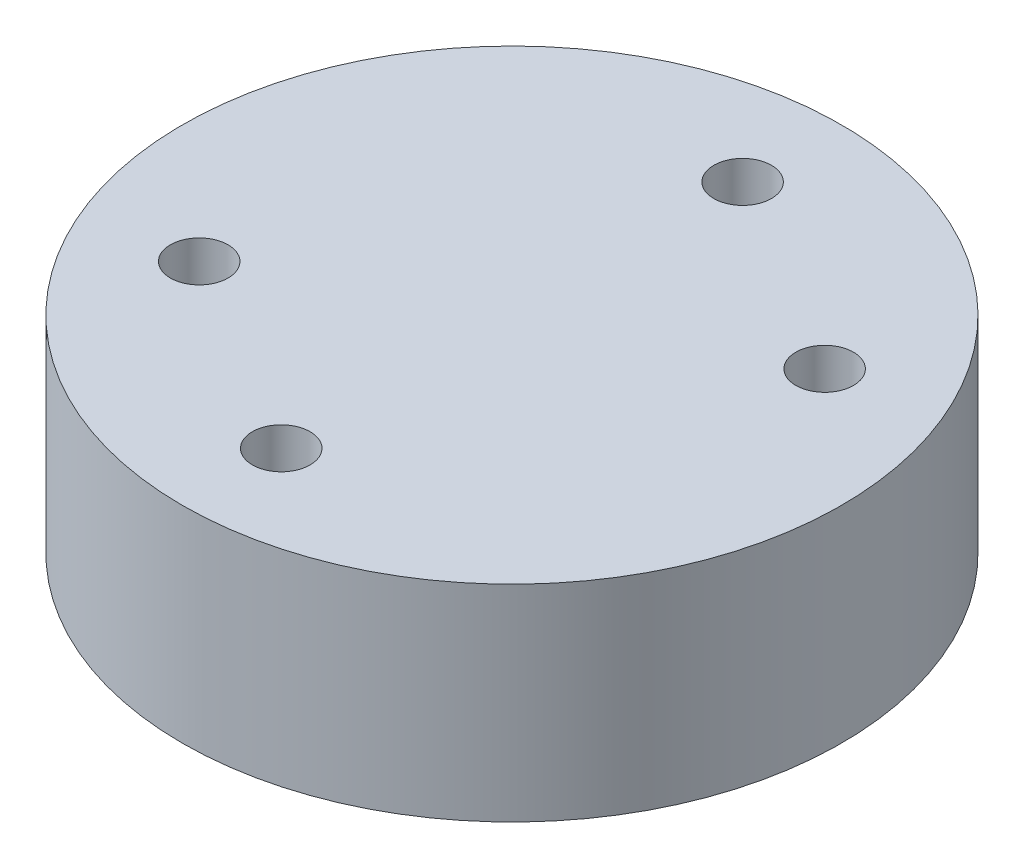
ISO-10303-21;
HEADER;
FILE_DESCRIPTION(('STEP AP214'),'2;1');
FILE_NAME('part.step','',(''),(''),'','','');
FILE_SCHEMA(('AUTOMOTIVE_DESIGN { 1 0 10303 214 1 1 1 1 }'));
ENDSEC;
DATA;
#1=APPLICATION_CONTEXT('core data for automotive mechanical design processes');
#2=APPLICATION_PROTOCOL_DEFINITION('international standard','automotive_design',2000,#1);
#3=PRODUCT_CONTEXT('',#1,'mechanical');
#4=PRODUCT('Part','Part','',(#3));
#5=PRODUCT_RELATED_PRODUCT_CATEGORY('part','',(#4));
#6=PRODUCT_DEFINITION_FORMATION('','',#4);
#7=PRODUCT_DEFINITION_CONTEXT('part definition',#1,'design');
#8=PRODUCT_DEFINITION('design','',#6,#7);
#9=PRODUCT_DEFINITION_SHAPE('','',#8);
#10=(LENGTH_UNIT() NAMED_UNIT(*) SI_UNIT(.MILLI.,.METRE.));
#11=(NAMED_UNIT(*) PLANE_ANGLE_UNIT() SI_UNIT($,.RADIAN.));
#12=(NAMED_UNIT(*) SI_UNIT($,.STERADIAN.) SOLID_ANGLE_UNIT());
#13=UNCERTAINTY_MEASURE_WITH_UNIT(LENGTH_MEASURE(1.E-05),#10,'distance_accuracy_value','');
#14=(GEOMETRIC_REPRESENTATION_CONTEXT(3) GLOBAL_UNCERTAINTY_ASSIGNED_CONTEXT((#13)) GLOBAL_UNIT_ASSIGNED_CONTEXT((#10,
#11,#12)) REPRESENTATION_CONTEXT('',''));
#15=CARTESIAN_POINT('',(0.,0.,0.));
#16=DIRECTION('',(0.,0.,1.));
#17=DIRECTION('',(1.,0.,0.));
#18=AXIS2_PLACEMENT_3D('',#15,#16,#17);
#19=CARTESIAN_POINT('',(0.,6.35,0.));
#20=DIRECTION('',(0.,-1.,0.));
#21=DIRECTION('',(0.,0.,-1.));
#22=AXIS2_PLACEMENT_3D('',#19,#20,#21);
#23=CYLINDRICAL_SURFACE('',#22,10.16);
#24=CARTESIAN_POINT('',(0.,6.35,0.));
#25=DIRECTION('',(0.,1.,0.));
#26=DIRECTION('',(0.,0.,1.));
#27=AXIS2_PLACEMENT_3D('',#24,#25,#26);
#28=CIRCLE('',#27,10.16);
#29=CARTESIAN_POINT('',(0.,6.35,10.16));
#30=VERTEX_POINT('',#29);
#31=EDGE_CURVE('E10',#30,#30,#28,.T.);
#32=ORIENTED_EDGE('',*,*,#31,.F.);
#33=EDGE_LOOP('',(#32));
#34=FACE_BOUND('',#33,.T.);
#35=CARTESIAN_POINT('',(0.,0.,0.));
#36=DIRECTION('',(0.,1.,0.));
#37=DIRECTION('',(0.,0.,1.));
#38=AXIS2_PLACEMENT_3D('',#35,#36,#37);
#39=CIRCLE('',#38,10.16);
#40=CARTESIAN_POINT('',(0.,0.,10.16));
#41=VERTEX_POINT('',#40);
#42=EDGE_CURVE('E42',#41,#41,#39,.T.);
#43=ORIENTED_EDGE('',*,*,#42,.T.);
#44=EDGE_LOOP('',(#43));
#45=FACE_BOUND('',#44,.T.);
#46=ADVANCED_FACE('F35',(#34,#45),#23,.T.);
#47=CARTESIAN_POINT('',(0.,6.35,0.));
#48=DIRECTION('',(0.,1.,0.));
#49=DIRECTION('',(0.,0.,1.));
#50=AXIS2_PLACEMENT_3D('',#47,#48,#49);
#51=PLANE('',#50);
#52=CARTESIAN_POINT('',(0.,6.35,-7.112));
#53=DIRECTION('',(0.,1.,0.));
#54=DIRECTION('',(0.,0.,1.));
#55=AXIS2_PLACEMENT_3D('',#52,#53,#54);
#56=CIRCLE('',#55,0.889);
#57=CARTESIAN_POINT('',(0.,6.35,-6.223));
#58=VERTEX_POINT('',#57);
#59=EDGE_CURVE('E56',#58,#58,#56,.T.);
#60=ORIENTED_EDGE('',*,*,#59,.F.);
#61=EDGE_LOOP('',(#60));
#62=FACE_BOUND('',#61,.T.);
#63=CARTESIAN_POINT('',(6.25387308459862,6.35,-3.38668206977463));
#64=DIRECTION('',(0.,1.,0.));
#65=DIRECTION('',(0.,0.,1.));
#66=AXIS2_PLACEMENT_3D('',#63,#64,#65);
#67=CIRCLE('',#66,0.889);
#68=CARTESIAN_POINT('',(6.25387308459862,6.35,-2.49768206977463));
#69=VERTEX_POINT('',#68);
#70=EDGE_CURVE('E112',#69,#69,#67,.T.);
#71=ORIENTED_EDGE('',*,*,#70,.F.);
#72=EDGE_LOOP('',(#71));
#73=FACE_BOUND('',#72,.T.);
#74=CARTESIAN_POINT('',(0.,6.35,7.112));
#75=DIRECTION('',(0.,1.,0.));
#76=DIRECTION('',(0.,0.,1.));
#77=AXIS2_PLACEMENT_3D('',#74,#75,#76);
#78=CIRCLE('',#77,0.889);
#79=CARTESIAN_POINT('',(0.,6.35,8.001));
#80=VERTEX_POINT('',#79);
#81=EDGE_CURVE('E105',#80,#80,#78,.T.);
#82=ORIENTED_EDGE('',*,*,#81,.F.);
#83=EDGE_LOOP('',(#82));
#84=FACE_BOUND('',#83,.T.);
#85=CARTESIAN_POINT('',(-6.25387308459862,6.35,3.38668206977463));
#86=DIRECTION('',(0.,1.,0.));
#87=DIRECTION('',(0.,0.,1.));
#88=AXIS2_PLACEMENT_3D('',#85,#86,#87);
#89=CIRCLE('',#88,0.889);
#90=CARTESIAN_POINT('',(-6.25387308459862,6.35,4.27568206977463));
#91=VERTEX_POINT('',#90);
#92=EDGE_CURVE('E49',#91,#91,#89,.T.);
#93=ORIENTED_EDGE('',*,*,#92,.F.);
#94=EDGE_LOOP('',(#93));
#95=FACE_BOUND('',#94,.T.);
#96=ORIENTED_EDGE('',*,*,#31,.T.);
#97=EDGE_LOOP('',(#96));
#98=FACE_BOUND('',#97,.T.);
#99=ADVANCED_FACE('F80',(#62,#73,#84,#95,#98),#51,.T.);
#100=CARTESIAN_POINT('',(0.,0.,0.));
#101=DIRECTION('',(0.,1.,0.));
#102=DIRECTION('',(0.,0.,1.));
#103=AXIS2_PLACEMENT_3D('',#100,#101,#102);
#104=PLANE('',#103);
#105=CARTESIAN_POINT('',(0.,0.,-7.112));
#106=DIRECTION('',(0.,1.,0.));
#107=DIRECTION('',(0.,0.,1.));
#108=AXIS2_PLACEMENT_3D('',#105,#106,#107);
#109=CIRCLE('',#108,0.889);
#110=CARTESIAN_POINT('',(0.,0.,-6.223));
#111=VERTEX_POINT('',#110);
#112=EDGE_CURVE('E38',#111,#111,#109,.T.);
#113=ORIENTED_EDGE('',*,*,#112,.T.);
#114=EDGE_LOOP('',(#113));
#115=FACE_BOUND('',#114,.T.);
#116=CARTESIAN_POINT('',(6.25387308459862,0.,-3.38668206977463));
#117=DIRECTION('',(0.,1.,0.));
#118=DIRECTION('',(0.,0.,1.));
#119=AXIS2_PLACEMENT_3D('',#116,#117,#118);
#120=CIRCLE('',#119,0.889);
#121=CARTESIAN_POINT('',(6.25387308459862,0.,-2.49768206977463));
#122=VERTEX_POINT('',#121);
#123=EDGE_CURVE('E58',#122,#122,#120,.T.);
#124=ORIENTED_EDGE('',*,*,#123,.T.);
#125=EDGE_LOOP('',(#124));
#126=FACE_BOUND('',#125,.T.);
#127=CARTESIAN_POINT('',(0.,0.,7.112));
#128=DIRECTION('',(0.,1.,0.));
#129=DIRECTION('',(0.,0.,1.));
#130=AXIS2_PLACEMENT_3D('',#127,#128,#129);
#131=CIRCLE('',#130,0.889);
#132=CARTESIAN_POINT('',(0.,0.,8.001));
#133=VERTEX_POINT('',#132);
#134=EDGE_CURVE('E55',#133,#133,#131,.T.);
#135=ORIENTED_EDGE('',*,*,#134,.T.);
#136=EDGE_LOOP('',(#135));
#137=FACE_BOUND('',#136,.T.);
#138=CARTESIAN_POINT('',(-6.25387308459862,0.,3.38668206977463));
#139=DIRECTION('',(0.,1.,0.));
#140=DIRECTION('',(0.,0.,1.));
#141=AXIS2_PLACEMENT_3D('',#138,#139,#140);
#142=CIRCLE('',#141,0.889);
#143=CARTESIAN_POINT('',(-6.25387308459862,0.,4.27568206977463));
#144=VERTEX_POINT('',#143);
#145=EDGE_CURVE('E52',#144,#144,#142,.T.);
#146=ORIENTED_EDGE('',*,*,#145,.T.);
#147=EDGE_LOOP('',(#146));
#148=FACE_BOUND('',#147,.T.);
#149=ORIENTED_EDGE('',*,*,#42,.F.);
#150=EDGE_LOOP('',(#149));
#151=FACE_BOUND('',#150,.T.);
#152=ADVANCED_FACE('F65',(#115,#126,#137,#148,#151),#104,.F.);
#153=CARTESIAN_POINT('',(-6.25387308459862,-1.27,3.38668206977463));
#154=DIRECTION('',(0.,1.,0.));
#155=DIRECTION('',(0.,0.,1.));
#156=AXIS2_PLACEMENT_3D('',#153,#154,#155);
#157=CYLINDRICAL_SURFACE('',#156,0.889);
#158=CARTESIAN_POINT('',(-6.25387308459862,6.35,4.27568206977463));
#159=CARTESIAN_POINT('',(-6.25387308459862,6.28385416666667,4.27568206977463));
#160=CARTESIAN_POINT('',(-6.25387308459862,6.21770833333333,4.27568206977463));
#161=CARTESIAN_POINT('',(-6.25387308459862,6.08541666666667,4.27568206977463));
#162=CARTESIAN_POINT('',(-6.25387308459862,6.01927083333333,4.27568206977463));
#163=CARTESIAN_POINT('',(-6.25387308459862,5.88697916666667,4.27568206977463));
#164=CARTESIAN_POINT('',(-6.25387308459862,5.82083333333333,4.27568206977463));
#165=CARTESIAN_POINT('',(-6.25387308459862,5.68854166666667,4.27568206977463));
#166=CARTESIAN_POINT('',(-6.25387308459862,5.62239583333333,4.27568206977463));
#167=CARTESIAN_POINT('',(-6.25387308459862,5.49010416666667,4.27568206977463));
#168=CARTESIAN_POINT('',(-6.25387308459862,5.42395833333333,4.27568206977463));
#169=CARTESIAN_POINT('',(-6.25387308459862,5.29166666666667,4.27568206977463));
#170=CARTESIAN_POINT('',(-6.25387308459862,5.22552083333333,4.27568206977463));
#171=CARTESIAN_POINT('',(-6.25387308459862,5.09322916666667,4.27568206977463));
#172=CARTESIAN_POINT('',(-6.25387308459862,5.02708333333333,4.27568206977463));
#173=CARTESIAN_POINT('',(-6.25387308459862,4.89479166666667,4.27568206977463));
#174=CARTESIAN_POINT('',(-6.25387308459862,4.82864583333333,4.27568206977463));
#175=CARTESIAN_POINT('',(-6.25387308459862,4.69635416666667,4.27568206977463));
#176=CARTESIAN_POINT('',(-6.25387308459862,4.63020833333333,4.27568206977463));
#177=CARTESIAN_POINT('',(-6.25387308459862,4.49791666666667,4.27568206977463));
#178=CARTESIAN_POINT('',(-6.25387308459862,4.43177083333333,4.27568206977463));
#179=CARTESIAN_POINT('',(-6.25387308459862,4.29947916666667,4.27568206977463));
#180=CARTESIAN_POINT('',(-6.25387308459862,4.23333333333333,4.27568206977463));
#181=CARTESIAN_POINT('',(-6.25387308459862,4.10104166666667,4.27568206977463));
#182=CARTESIAN_POINT('',(-6.25387308459862,4.03489583333333,4.27568206977463));
#183=CARTESIAN_POINT('',(-6.25387308459862,3.90260416666667,4.27568206977463));
#184=CARTESIAN_POINT('',(-6.25387308459862,3.83645833333333,4.27568206977463));
#185=CARTESIAN_POINT('',(-6.25387308459862,3.70416666666667,4.27568206977463));
#186=CARTESIAN_POINT('',(-6.25387308459862,3.63802083333333,4.27568206977463));
#187=CARTESIAN_POINT('',(-6.25387308459862,3.50572916666667,4.27568206977463));
#188=CARTESIAN_POINT('',(-6.25387308459862,3.43958333333333,4.27568206977463));
#189=CARTESIAN_POINT('',(-6.25387308459862,3.30729166666667,4.27568206977463));
#190=CARTESIAN_POINT('',(-6.25387308459862,3.24114583333333,4.27568206977463));
#191=CARTESIAN_POINT('',(-6.25387308459862,3.10885416666667,4.27568206977463));
#192=CARTESIAN_POINT('',(-6.25387308459862,3.04270833333333,4.27568206977463));
#193=CARTESIAN_POINT('',(-6.25387308459862,2.91041666666667,4.27568206977463));
#194=CARTESIAN_POINT('',(-6.25387308459862,2.84427083333333,4.27568206977463));
#195=CARTESIAN_POINT('',(-6.25387308459862,2.71197916666667,4.27568206977463));
#196=CARTESIAN_POINT('',(-6.25387308459862,2.64583333333333,4.27568206977463));
#197=CARTESIAN_POINT('',(-6.25387308459862,2.51354166666667,4.27568206977463));
#198=CARTESIAN_POINT('',(-6.25387308459862,2.44739583333333,4.27568206977463));
#199=CARTESIAN_POINT('',(-6.25387308459862,2.31510416666667,4.27568206977463));
#200=CARTESIAN_POINT('',(-6.25387308459862,2.24895833333333,4.27568206977463));
#201=CARTESIAN_POINT('',(-6.25387308459862,2.11666666666667,4.27568206977463));
#202=CARTESIAN_POINT('',(-6.25387308459862,2.05052083333333,4.27568206977463));
#203=CARTESIAN_POINT('',(-6.25387308459862,1.91822916666667,4.27568206977463));
#204=CARTESIAN_POINT('',(-6.25387308459862,1.85208333333333,4.27568206977463));
#205=CARTESIAN_POINT('',(-6.25387308459862,1.71979166666667,4.27568206977463));
#206=CARTESIAN_POINT('',(-6.25387308459862,1.65364583333333,4.27568206977463));
#207=CARTESIAN_POINT('',(-6.25387308459862,1.52135416666667,4.27568206977463));
#208=CARTESIAN_POINT('',(-6.25387308459862,1.45520833333333,4.27568206977463));
#209=CARTESIAN_POINT('',(-6.25387308459862,1.32291666666667,4.27568206977463));
#210=CARTESIAN_POINT('',(-6.25387308459862,1.25677083333333,4.27568206977463));
#211=CARTESIAN_POINT('',(-6.25387308459862,1.12447916666667,4.27568206977463));
#212=CARTESIAN_POINT('',(-6.25387308459862,1.05833333333333,4.27568206977463));
#213=CARTESIAN_POINT('',(-6.25387308459862,0.926041666666666,4.27568206977463));
#214=CARTESIAN_POINT('',(-6.25387308459862,0.859895833333333,4.27568206977463));
#215=CARTESIAN_POINT('',(-6.25387308459862,0.727604166666666,4.27568206977463));
#216=CARTESIAN_POINT('',(-6.25387308459862,0.661458333333333,4.27568206977463));
#217=CARTESIAN_POINT('',(-6.25387308459862,0.529166666666666,4.27568206977463));
#218=CARTESIAN_POINT('',(-6.25387308459862,0.463020833333333,4.27568206977463));
#219=CARTESIAN_POINT('',(-6.25387308459862,0.330729166666666,4.27568206977463));
#220=CARTESIAN_POINT('',(-6.25387308459862,0.264583333333333,4.27568206977463));
#221=CARTESIAN_POINT('',(-6.25387308459862,0.132291666666666,4.27568206977463));
#222=CARTESIAN_POINT('',(-6.25387308459862,0.066145833333333,4.27568206977463));
#223=CARTESIAN_POINT('',(-6.25387308459862,0.,4.27568206977463));
#224=B_SPLINE_CURVE_WITH_KNOTS('',3,(#158,#159,#160,#161,#162,#163,#164,#165,#166,#167,#168,
#169,#170,#171,#172,#173,#174,#175,#176,#177,#178,#179,#180,#181,#182,#183,#184,#185,#186,#187,
#188,#189,#190,#191,#192,#193,#194,#195,#196,#197,#198,#199,#200,#201,#202,#203,#204,#205,#206,
#207,#208,#209,#210,#211,#212,#213,#214,#215,#216,#217,#218,#219,#220,#221,#222,#223),
.UNSPECIFIED.,.F.,.F.,(4,2,2,2,2,2,2,2,2,2,2,2,2,2,2,2,2,2,2,2,2,2,2,2,2,2,2,2,2,2,2,2,4),(0.,
0.1984375,0.396875,0.5953125,0.79375,0.9921875,1.190625,1.3890625,1.5875,1.7859375,1.984375,
2.1828125,2.38125,2.5796875,2.778125,2.9765625,3.175,3.3734375,3.571875,3.7703125,3.96875,
4.1671875,4.365625,4.5640625,4.7625,4.9609375,5.159375,5.3578125,5.55625,5.7546875,5.953125,
6.1515625,6.35),.UNSPECIFIED.);
#225=EDGE_CURVE('BSEAM91',#91,#144,#224,.T.);
#226=ORIENTED_EDGE('',*,*,#92,.T.);
#227=ORIENTED_EDGE('',*,*,#145,.F.);
#228=ORIENTED_EDGE('',*,*,#225,.T.);
#229=ORIENTED_EDGE('',*,*,#225,.F.);
#230=EDGE_LOOP('',(#226,#228,#227,#229));
#231=FACE_BOUND('',#230,.T.);
#232=ADVANCED_FACE('F91',(#231),#157,.F.);
#233=CARTESIAN_POINT('',(0.,-1.27,7.112));
#234=DIRECTION('',(0.,1.,0.));
#235=DIRECTION('',(0.,0.,1.));
#236=AXIS2_PLACEMENT_3D('',#233,#234,#235);
#237=CYLINDRICAL_SURFACE('',#236,0.889);
#238=CARTESIAN_POINT('',(0.,6.35,8.001));
#239=CARTESIAN_POINT('',(0.,6.28385416666667,8.001));
#240=CARTESIAN_POINT('',(0.,6.21770833333333,8.001));
#241=CARTESIAN_POINT('',(0.,6.08541666666667,8.001));
#242=CARTESIAN_POINT('',(0.,6.01927083333333,8.001));
#243=CARTESIAN_POINT('',(0.,5.88697916666667,8.001));
#244=CARTESIAN_POINT('',(0.,5.82083333333333,8.001));
#245=CARTESIAN_POINT('',(0.,5.68854166666667,8.001));
#246=CARTESIAN_POINT('',(0.,5.62239583333333,8.001));
#247=CARTESIAN_POINT('',(0.,5.49010416666667,8.001));
#248=CARTESIAN_POINT('',(0.,5.42395833333333,8.001));
#249=CARTESIAN_POINT('',(0.,5.29166666666667,8.001));
#250=CARTESIAN_POINT('',(0.,5.22552083333333,8.001));
#251=CARTESIAN_POINT('',(0.,5.09322916666667,8.001));
#252=CARTESIAN_POINT('',(0.,5.02708333333333,8.001));
#253=CARTESIAN_POINT('',(0.,4.89479166666667,8.001));
#254=CARTESIAN_POINT('',(0.,4.82864583333333,8.001));
#255=CARTESIAN_POINT('',(0.,4.69635416666667,8.001));
#256=CARTESIAN_POINT('',(0.,4.63020833333333,8.001));
#257=CARTESIAN_POINT('',(0.,4.49791666666667,8.001));
#258=CARTESIAN_POINT('',(0.,4.43177083333333,8.001));
#259=CARTESIAN_POINT('',(0.,4.29947916666667,8.001));
#260=CARTESIAN_POINT('',(0.,4.23333333333333,8.001));
#261=CARTESIAN_POINT('',(0.,4.10104166666667,8.001));
#262=CARTESIAN_POINT('',(0.,4.03489583333333,8.001));
#263=CARTESIAN_POINT('',(0.,3.90260416666667,8.001));
#264=CARTESIAN_POINT('',(0.,3.83645833333333,8.001));
#265=CARTESIAN_POINT('',(0.,3.70416666666667,8.001));
#266=CARTESIAN_POINT('',(0.,3.63802083333333,8.001));
#267=CARTESIAN_POINT('',(0.,3.50572916666667,8.001));
#268=CARTESIAN_POINT('',(0.,3.43958333333333,8.001));
#269=CARTESIAN_POINT('',(0.,3.30729166666667,8.001));
#270=CARTESIAN_POINT('',(0.,3.24114583333333,8.001));
#271=CARTESIAN_POINT('',(0.,3.10885416666667,8.001));
#272=CARTESIAN_POINT('',(0.,3.04270833333333,8.001));
#273=CARTESIAN_POINT('',(0.,2.91041666666667,8.001));
#274=CARTESIAN_POINT('',(0.,2.84427083333333,8.001));
#275=CARTESIAN_POINT('',(0.,2.71197916666667,8.001));
#276=CARTESIAN_POINT('',(0.,2.64583333333333,8.001));
#277=CARTESIAN_POINT('',(0.,2.51354166666667,8.001));
#278=CARTESIAN_POINT('',(0.,2.44739583333333,8.001));
#279=CARTESIAN_POINT('',(0.,2.31510416666667,8.001));
#280=CARTESIAN_POINT('',(0.,2.24895833333333,8.001));
#281=CARTESIAN_POINT('',(0.,2.11666666666667,8.001));
#282=CARTESIAN_POINT('',(0.,2.05052083333333,8.001));
#283=CARTESIAN_POINT('',(0.,1.91822916666667,8.001));
#284=CARTESIAN_POINT('',(0.,1.85208333333333,8.001));
#285=CARTESIAN_POINT('',(0.,1.71979166666667,8.001));
#286=CARTESIAN_POINT('',(0.,1.65364583333333,8.001));
#287=CARTESIAN_POINT('',(0.,1.52135416666667,8.001));
#288=CARTESIAN_POINT('',(0.,1.45520833333333,8.001));
#289=CARTESIAN_POINT('',(0.,1.32291666666667,8.001));
#290=CARTESIAN_POINT('',(0.,1.25677083333333,8.001));
#291=CARTESIAN_POINT('',(0.,1.12447916666667,8.001));
#292=CARTESIAN_POINT('',(0.,1.05833333333333,8.001));
#293=CARTESIAN_POINT('',(0.,0.926041666666666,8.001));
#294=CARTESIAN_POINT('',(0.,0.859895833333333,8.001));
#295=CARTESIAN_POINT('',(0.,0.727604166666666,8.001));
#296=CARTESIAN_POINT('',(0.,0.661458333333333,8.001));
#297=CARTESIAN_POINT('',(0.,0.529166666666666,8.001));
#298=CARTESIAN_POINT('',(0.,0.463020833333333,8.001));
#299=CARTESIAN_POINT('',(0.,0.330729166666666,8.001));
#300=CARTESIAN_POINT('',(0.,0.264583333333333,8.001));
#301=CARTESIAN_POINT('',(0.,0.132291666666666,8.001));
#302=CARTESIAN_POINT('',(0.,0.066145833333333,8.001));
#303=CARTESIAN_POINT('',(0.,0.,8.001));
#304=B_SPLINE_CURVE_WITH_KNOTS('',3,(#238,#239,#240,#241,#242,#243,#244,#245,#246,#247,#248,
#249,#250,#251,#252,#253,#254,#255,#256,#257,#258,#259,#260,#261,#262,#263,#264,#265,#266,#267,
#268,#269,#270,#271,#272,#273,#274,#275,#276,#277,#278,#279,#280,#281,#282,#283,#284,#285,#286,
#287,#288,#289,#290,#291,#292,#293,#294,#295,#296,#297,#298,#299,#300,#301,#302,#303),
.UNSPECIFIED.,.F.,.F.,(4,2,2,2,2,2,2,2,2,2,2,2,2,2,2,2,2,2,2,2,2,2,2,2,2,2,2,2,2,2,2,2,4),(0.,
0.1984375,0.396875,0.5953125,0.79375,0.9921875,1.190625,1.3890625,1.5875,1.7859375,1.984375,
2.1828125,2.38125,2.5796875,2.778125,2.9765625,3.175,3.3734375,3.571875,3.7703125,3.96875,
4.1671875,4.365625,4.5640625,4.7625,4.9609375,5.159375,5.3578125,5.55625,5.7546875,5.953125,
6.1515625,6.35),.UNSPECIFIED.);
#305=EDGE_CURVE('BSEAM75',#80,#133,#304,.T.);
#306=ORIENTED_EDGE('',*,*,#81,.T.);
#307=ORIENTED_EDGE('',*,*,#134,.F.);
#308=ORIENTED_EDGE('',*,*,#305,.T.);
#309=ORIENTED_EDGE('',*,*,#305,.F.);
#310=EDGE_LOOP('',(#306,#308,#307,#309));
#311=FACE_BOUND('',#310,.T.);
#312=ADVANCED_FACE('F75',(#311),#237,.F.);
#313=CARTESIAN_POINT('',(6.25387308459862,-1.27,-3.38668206977463));
#314=DIRECTION('',(0.,1.,0.));
#315=DIRECTION('',(0.,0.,1.));
#316=AXIS2_PLACEMENT_3D('',#313,#314,#315);
#317=CYLINDRICAL_SURFACE('',#316,0.889);
#318=CARTESIAN_POINT('',(6.25387308459862,6.35,-2.49768206977463));
#319=CARTESIAN_POINT('',(6.25387308459862,6.28385416666667,-2.49768206977463));
#320=CARTESIAN_POINT('',(6.25387308459862,6.21770833333333,-2.49768206977463));
#321=CARTESIAN_POINT('',(6.25387308459862,6.08541666666667,-2.49768206977463));
#322=CARTESIAN_POINT('',(6.25387308459862,6.01927083333333,-2.49768206977463));
#323=CARTESIAN_POINT('',(6.25387308459862,5.88697916666667,-2.49768206977463));
#324=CARTESIAN_POINT('',(6.25387308459862,5.82083333333333,-2.49768206977463));
#325=CARTESIAN_POINT('',(6.25387308459862,5.68854166666667,-2.49768206977463));
#326=CARTESIAN_POINT('',(6.25387308459862,5.62239583333333,-2.49768206977463));
#327=CARTESIAN_POINT('',(6.25387308459862,5.49010416666667,-2.49768206977463));
#328=CARTESIAN_POINT('',(6.25387308459862,5.42395833333333,-2.49768206977463));
#329=CARTESIAN_POINT('',(6.25387308459862,5.29166666666667,-2.49768206977463));
#330=CARTESIAN_POINT('',(6.25387308459862,5.22552083333333,-2.49768206977463));
#331=CARTESIAN_POINT('',(6.25387308459862,5.09322916666667,-2.49768206977463));
#332=CARTESIAN_POINT('',(6.25387308459862,5.02708333333333,-2.49768206977463));
#333=CARTESIAN_POINT('',(6.25387308459862,4.89479166666667,-2.49768206977463));
#334=CARTESIAN_POINT('',(6.25387308459862,4.82864583333333,-2.49768206977463));
#335=CARTESIAN_POINT('',(6.25387308459862,4.69635416666667,-2.49768206977463));
#336=CARTESIAN_POINT('',(6.25387308459862,4.63020833333333,-2.49768206977463));
#337=CARTESIAN_POINT('',(6.25387308459862,4.49791666666667,-2.49768206977463));
#338=CARTESIAN_POINT('',(6.25387308459862,4.43177083333333,-2.49768206977463));
#339=CARTESIAN_POINT('',(6.25387308459862,4.29947916666667,-2.49768206977463));
#340=CARTESIAN_POINT('',(6.25387308459862,4.23333333333333,-2.49768206977463));
#341=CARTESIAN_POINT('',(6.25387308459862,4.10104166666667,-2.49768206977463));
#342=CARTESIAN_POINT('',(6.25387308459862,4.03489583333333,-2.49768206977463));
#343=CARTESIAN_POINT('',(6.25387308459862,3.90260416666667,-2.49768206977463));
#344=CARTESIAN_POINT('',(6.25387308459862,3.83645833333333,-2.49768206977463));
#345=CARTESIAN_POINT('',(6.25387308459862,3.70416666666667,-2.49768206977463));
#346=CARTESIAN_POINT('',(6.25387308459862,3.63802083333333,-2.49768206977463));
#347=CARTESIAN_POINT('',(6.25387308459862,3.50572916666667,-2.49768206977463));
#348=CARTESIAN_POINT('',(6.25387308459862,3.43958333333333,-2.49768206977463));
#349=CARTESIAN_POINT('',(6.25387308459862,3.30729166666667,-2.49768206977463));
#350=CARTESIAN_POINT('',(6.25387308459862,3.24114583333333,-2.49768206977463));
#351=CARTESIAN_POINT('',(6.25387308459862,3.10885416666667,-2.49768206977463));
#352=CARTESIAN_POINT('',(6.25387308459862,3.04270833333333,-2.49768206977463));
#353=CARTESIAN_POINT('',(6.25387308459862,2.91041666666667,-2.49768206977463));
#354=CARTESIAN_POINT('',(6.25387308459862,2.84427083333333,-2.49768206977463));
#355=CARTESIAN_POINT('',(6.25387308459862,2.71197916666667,-2.49768206977463));
#356=CARTESIAN_POINT('',(6.25387308459862,2.64583333333333,-2.49768206977463));
#357=CARTESIAN_POINT('',(6.25387308459862,2.51354166666667,-2.49768206977463));
#358=CARTESIAN_POINT('',(6.25387308459862,2.44739583333333,-2.49768206977463));
#359=CARTESIAN_POINT('',(6.25387308459862,2.31510416666667,-2.49768206977463));
#360=CARTESIAN_POINT('',(6.25387308459862,2.24895833333333,-2.49768206977463));
#361=CARTESIAN_POINT('',(6.25387308459862,2.11666666666667,-2.49768206977463));
#362=CARTESIAN_POINT('',(6.25387308459862,2.05052083333333,-2.49768206977463));
#363=CARTESIAN_POINT('',(6.25387308459862,1.91822916666667,-2.49768206977463));
#364=CARTESIAN_POINT('',(6.25387308459862,1.85208333333333,-2.49768206977463));
#365=CARTESIAN_POINT('',(6.25387308459862,1.71979166666667,-2.49768206977463));
#366=CARTESIAN_POINT('',(6.25387308459862,1.65364583333333,-2.49768206977463));
#367=CARTESIAN_POINT('',(6.25387308459862,1.52135416666667,-2.49768206977463));
#368=CARTESIAN_POINT('',(6.25387308459862,1.45520833333333,-2.49768206977463));
#369=CARTESIAN_POINT('',(6.25387308459862,1.32291666666667,-2.49768206977463));
#370=CARTESIAN_POINT('',(6.25387308459862,1.25677083333333,-2.49768206977463));
#371=CARTESIAN_POINT('',(6.25387308459862,1.12447916666667,-2.49768206977463));
#372=CARTESIAN_POINT('',(6.25387308459862,1.05833333333333,-2.49768206977463));
#373=CARTESIAN_POINT('',(6.25387308459862,0.926041666666666,-2.49768206977463));
#374=CARTESIAN_POINT('',(6.25387308459862,0.859895833333333,-2.49768206977463));
#375=CARTESIAN_POINT('',(6.25387308459862,0.727604166666666,-2.49768206977463));
#376=CARTESIAN_POINT('',(6.25387308459862,0.661458333333333,-2.49768206977463));
#377=CARTESIAN_POINT('',(6.25387308459862,0.529166666666666,-2.49768206977463));
#378=CARTESIAN_POINT('',(6.25387308459862,0.463020833333333,-2.49768206977463));
#379=CARTESIAN_POINT('',(6.25387308459862,0.330729166666666,-2.49768206977463));
#380=CARTESIAN_POINT('',(6.25387308459862,0.264583333333333,-2.49768206977463));
#381=CARTESIAN_POINT('',(6.25387308459862,0.132291666666666,-2.49768206977463));
#382=CARTESIAN_POINT('',(6.25387308459862,0.066145833333333,-2.49768206977463));
#383=CARTESIAN_POINT('',(6.25387308459862,0.,-2.49768206977463));
#384=B_SPLINE_CURVE_WITH_KNOTS('',3,(#318,#319,#320,#321,#322,#323,#324,#325,#326,#327,#328,
#329,#330,#331,#332,#333,#334,#335,#336,#337,#338,#339,#340,#341,#342,#343,#344,#345,#346,#347,
#348,#349,#350,#351,#352,#353,#354,#355,#356,#357,#358,#359,#360,#361,#362,#363,#364,#365,#366,
#367,#368,#369,#370,#371,#372,#373,#374,#375,#376,#377,#378,#379,#380,#381,#382,#383),
.UNSPECIFIED.,.F.,.F.,(4,2,2,2,2,2,2,2,2,2,2,2,2,2,2,2,2,2,2,2,2,2,2,2,2,2,2,2,2,2,2,2,4),(0.,
0.1984375,0.396875,0.5953125,0.79375,0.9921875,1.190625,1.3890625,1.5875,1.7859375,1.984375,
2.1828125,2.38125,2.5796875,2.778125,2.9765625,3.175,3.3734375,3.571875,3.7703125,3.96875,
4.1671875,4.365625,4.5640625,4.7625,4.9609375,5.159375,5.3578125,5.55625,5.7546875,5.953125,
6.1515625,6.35),.UNSPECIFIED.);
#385=EDGE_CURVE('BSEAM69',#69,#122,#384,.T.);
#386=ORIENTED_EDGE('',*,*,#70,.T.);
#387=ORIENTED_EDGE('',*,*,#123,.F.);
#388=ORIENTED_EDGE('',*,*,#385,.T.);
#389=ORIENTED_EDGE('',*,*,#385,.F.);
#390=EDGE_LOOP('',(#386,#388,#387,#389));
#391=FACE_BOUND('',#390,.T.);
#392=ADVANCED_FACE('F69',(#391),#317,.F.);
#393=CARTESIAN_POINT('',(0.,-1.27,-7.112));
#394=DIRECTION('',(0.,1.,0.));
#395=DIRECTION('',(0.,0.,1.));
#396=AXIS2_PLACEMENT_3D('',#393,#394,#395);
#397=CYLINDRICAL_SURFACE('',#396,0.889);
#398=CARTESIAN_POINT('',(0.,6.35,-6.223));
#399=CARTESIAN_POINT('',(0.,6.28385416666667,-6.223));
#400=CARTESIAN_POINT('',(0.,6.21770833333333,-6.223));
#401=CARTESIAN_POINT('',(0.,6.08541666666667,-6.223));
#402=CARTESIAN_POINT('',(0.,6.01927083333333,-6.223));
#403=CARTESIAN_POINT('',(0.,5.88697916666667,-6.223));
#404=CARTESIAN_POINT('',(0.,5.82083333333333,-6.223));
#405=CARTESIAN_POINT('',(0.,5.68854166666667,-6.223));
#406=CARTESIAN_POINT('',(0.,5.62239583333333,-6.223));
#407=CARTESIAN_POINT('',(0.,5.49010416666667,-6.223));
#408=CARTESIAN_POINT('',(0.,5.42395833333333,-6.223));
#409=CARTESIAN_POINT('',(0.,5.29166666666667,-6.223));
#410=CARTESIAN_POINT('',(0.,5.22552083333333,-6.223));
#411=CARTESIAN_POINT('',(0.,5.09322916666667,-6.223));
#412=CARTESIAN_POINT('',(0.,5.02708333333333,-6.223));
#413=CARTESIAN_POINT('',(0.,4.89479166666667,-6.223));
#414=CARTESIAN_POINT('',(0.,4.82864583333333,-6.223));
#415=CARTESIAN_POINT('',(0.,4.69635416666667,-6.223));
#416=CARTESIAN_POINT('',(0.,4.63020833333333,-6.223));
#417=CARTESIAN_POINT('',(0.,4.49791666666667,-6.223));
#418=CARTESIAN_POINT('',(0.,4.43177083333333,-6.223));
#419=CARTESIAN_POINT('',(0.,4.29947916666667,-6.223));
#420=CARTESIAN_POINT('',(0.,4.23333333333333,-6.223));
#421=CARTESIAN_POINT('',(0.,4.10104166666667,-6.223));
#422=CARTESIAN_POINT('',(0.,4.03489583333333,-6.223));
#423=CARTESIAN_POINT('',(0.,3.90260416666667,-6.223));
#424=CARTESIAN_POINT('',(0.,3.83645833333333,-6.223));
#425=CARTESIAN_POINT('',(0.,3.70416666666667,-6.223));
#426=CARTESIAN_POINT('',(0.,3.63802083333333,-6.223));
#427=CARTESIAN_POINT('',(0.,3.50572916666667,-6.223));
#428=CARTESIAN_POINT('',(0.,3.43958333333333,-6.223));
#429=CARTESIAN_POINT('',(0.,3.30729166666667,-6.223));
#430=CARTESIAN_POINT('',(0.,3.24114583333333,-6.223));
#431=CARTESIAN_POINT('',(0.,3.10885416666667,-6.223));
#432=CARTESIAN_POINT('',(0.,3.04270833333333,-6.223));
#433=CARTESIAN_POINT('',(0.,2.91041666666667,-6.223));
#434=CARTESIAN_POINT('',(0.,2.84427083333333,-6.223));
#435=CARTESIAN_POINT('',(0.,2.71197916666667,-6.223));
#436=CARTESIAN_POINT('',(0.,2.64583333333333,-6.223));
#437=CARTESIAN_POINT('',(0.,2.51354166666667,-6.223));
#438=CARTESIAN_POINT('',(0.,2.44739583333333,-6.223));
#439=CARTESIAN_POINT('',(0.,2.31510416666667,-6.223));
#440=CARTESIAN_POINT('',(0.,2.24895833333333,-6.223));
#441=CARTESIAN_POINT('',(0.,2.11666666666667,-6.223));
#442=CARTESIAN_POINT('',(0.,2.05052083333333,-6.223));
#443=CARTESIAN_POINT('',(0.,1.91822916666667,-6.223));
#444=CARTESIAN_POINT('',(0.,1.85208333333333,-6.223));
#445=CARTESIAN_POINT('',(0.,1.71979166666667,-6.223));
#446=CARTESIAN_POINT('',(0.,1.65364583333333,-6.223));
#447=CARTESIAN_POINT('',(0.,1.52135416666667,-6.223));
#448=CARTESIAN_POINT('',(0.,1.45520833333333,-6.223));
#449=CARTESIAN_POINT('',(0.,1.32291666666667,-6.223));
#450=CARTESIAN_POINT('',(0.,1.25677083333333,-6.223));
#451=CARTESIAN_POINT('',(0.,1.12447916666667,-6.223));
#452=CARTESIAN_POINT('',(0.,1.05833333333333,-6.223));
#453=CARTESIAN_POINT('',(0.,0.926041666666666,-6.223));
#454=CARTESIAN_POINT('',(0.,0.859895833333333,-6.223));
#455=CARTESIAN_POINT('',(0.,0.727604166666666,-6.223));
#456=CARTESIAN_POINT('',(0.,0.661458333333333,-6.223));
#457=CARTESIAN_POINT('',(0.,0.529166666666666,-6.223));
#458=CARTESIAN_POINT('',(0.,0.463020833333333,-6.223));
#459=CARTESIAN_POINT('',(0.,0.330729166666666,-6.223));
#460=CARTESIAN_POINT('',(0.,0.264583333333333,-6.223));
#461=CARTESIAN_POINT('',(0.,0.132291666666666,-6.223));
#462=CARTESIAN_POINT('',(0.,0.066145833333333,-6.223));
#463=CARTESIAN_POINT('',(0.,0.,-6.223));
#464=B_SPLINE_CURVE_WITH_KNOTS('',3,(#398,#399,#400,#401,#402,#403,#404,#405,#406,#407,#408,
#409,#410,#411,#412,#413,#414,#415,#416,#417,#418,#419,#420,#421,#422,#423,#424,#425,#426,#427,
#428,#429,#430,#431,#432,#433,#434,#435,#436,#437,#438,#439,#440,#441,#442,#443,#444,#445,#446,
#447,#448,#449,#450,#451,#452,#453,#454,#455,#456,#457,#458,#459,#460,#461,#462,#463),
.UNSPECIFIED.,.F.,.F.,(4,2,2,2,2,2,2,2,2,2,2,2,2,2,2,2,2,2,2,2,2,2,2,2,2,2,2,2,2,2,2,2,4),(0.,
0.1984375,0.396875,0.5953125,0.79375,0.9921875,1.190625,1.3890625,1.5875,1.7859375,1.984375,
2.1828125,2.38125,2.5796875,2.778125,2.9765625,3.175,3.3734375,3.571875,3.7703125,3.96875,
4.1671875,4.365625,4.5640625,4.7625,4.9609375,5.159375,5.3578125,5.55625,5.7546875,5.953125,
6.1515625,6.35),.UNSPECIFIED.);
#465=EDGE_CURVE('BSEAM67',#58,#111,#464,.T.);
#466=ORIENTED_EDGE('',*,*,#59,.T.);
#467=ORIENTED_EDGE('',*,*,#112,.F.);
#468=ORIENTED_EDGE('',*,*,#465,.T.);
#469=ORIENTED_EDGE('',*,*,#465,.F.);
#470=EDGE_LOOP('',(#466,#468,#467,#469));
#471=FACE_BOUND('',#470,.T.);
#472=ADVANCED_FACE('F67',(#471),#397,.F.);
#473=CLOSED_SHELL('',(#46,#99,#152,#232,#312,#392,#472));
#474=MANIFOLD_SOLID_BREP('B2',#473);
#475=ADVANCED_BREP_SHAPE_REPRESENTATION('',(#18,#474),#14);
#476=SHAPE_DEFINITION_REPRESENTATION(#9,#475);
ENDSEC;
END-ISO-10303-21;
